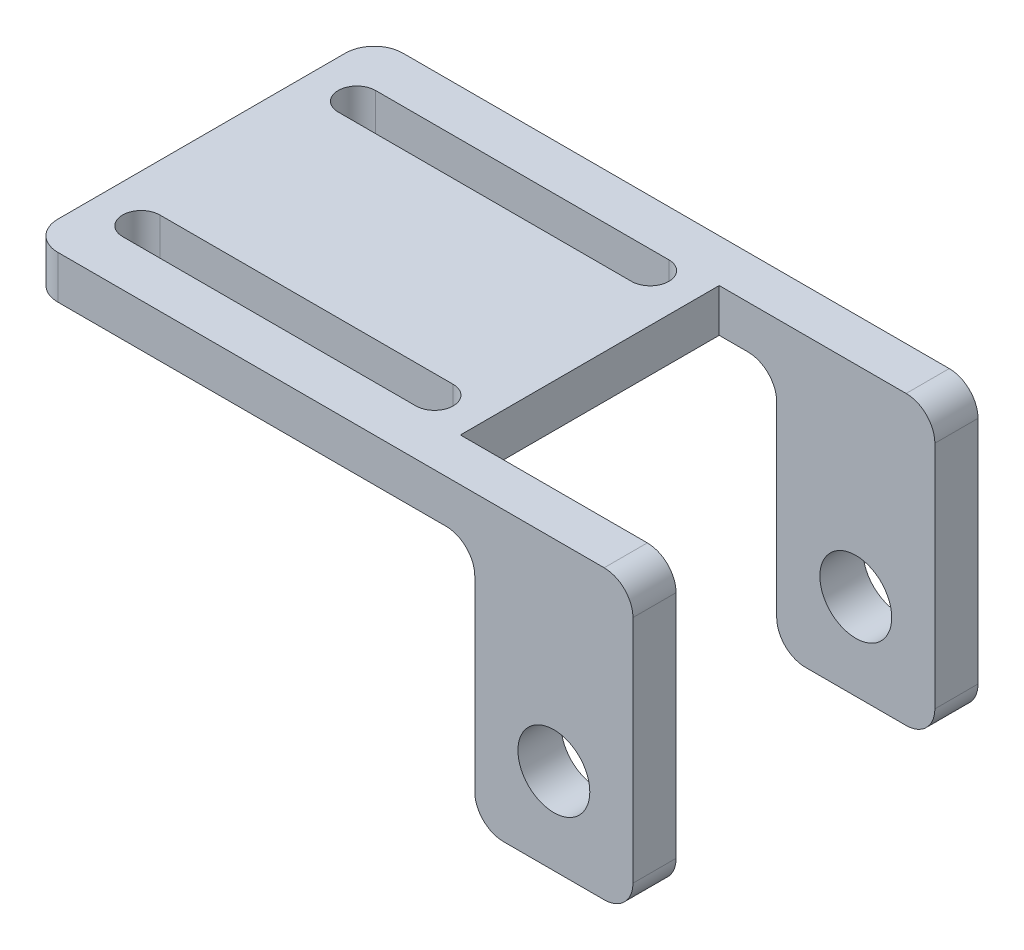
ISO-10303-21;
HEADER;
FILE_DESCRIPTION(('STEP AP214'),'2;1');
FILE_NAME('part.step','',(''),(''),'','','');
FILE_SCHEMA(('AUTOMOTIVE_DESIGN { 1 0 10303 214 1 1 1 1 }'));
ENDSEC;
DATA;
#1=APPLICATION_CONTEXT('core data for automotive mechanical design processes');
#2=APPLICATION_PROTOCOL_DEFINITION('international standard','automotive_design',2000,#1);
#3=PRODUCT_CONTEXT('',#1,'mechanical');
#4=PRODUCT('Part','Part','',(#3));
#5=PRODUCT_RELATED_PRODUCT_CATEGORY('part','',(#4));
#6=PRODUCT_DEFINITION_FORMATION('','',#4);
#7=PRODUCT_DEFINITION_CONTEXT('part definition',#1,'design');
#8=PRODUCT_DEFINITION('design','',#6,#7);
#9=PRODUCT_DEFINITION_SHAPE('','',#8);
#10=(LENGTH_UNIT() NAMED_UNIT(*) SI_UNIT(.MILLI.,.METRE.));
#11=(NAMED_UNIT(*) PLANE_ANGLE_UNIT() SI_UNIT($,.RADIAN.));
#12=(NAMED_UNIT(*) SI_UNIT($,.STERADIAN.) SOLID_ANGLE_UNIT());
#13=UNCERTAINTY_MEASURE_WITH_UNIT(LENGTH_MEASURE(1.E-05),#10,'distance_accuracy_value','');
#14=(GEOMETRIC_REPRESENTATION_CONTEXT(3) GLOBAL_UNCERTAINTY_ASSIGNED_CONTEXT((#13)) GLOBAL_UNIT_ASSIGNED_CONTEXT((#10,
#11,#12)) REPRESENTATION_CONTEXT('',''));
#15=CARTESIAN_POINT('',(0.,0.,0.));
#16=DIRECTION('',(0.,0.,1.));
#17=DIRECTION('',(1.,0.,0.));
#18=AXIS2_PLACEMENT_3D('',#15,#16,#17);
#19=CARTESIAN_POINT('',(42.,3.,0.));
#20=DIRECTION('',(-1.,0.,0.));
#21=DIRECTION('',(0.,0.,1.));
#22=AXIS2_PLACEMENT_3D('',#19,#20,#21);
#23=PLANE('',#22);
#24=DIRECTION('',(0.,1.,0.));
#25=VECTOR('',#24,1.);
#26=CARTESIAN_POINT('',(42.,-17.,-3.));
#27=LINE('',#26,#25);
#28=CARTESIAN_POINT('',(42.,-15.,-3.));
#29=VERTEX_POINT('',#28);
#30=CARTESIAN_POINT('',(42.,1.,-3.));
#31=VERTEX_POINT('',#30);
#32=EDGE_CURVE('E351',#29,#31,#27,.T.);
#33=ORIENTED_EDGE('',*,*,#32,.T.);
#34=DIRECTION('',(0.,0.,-1.));
#35=VECTOR('',#34,1.);
#36=CARTESIAN_POINT('',(42.,1.,0.));
#37=LINE('',#36,#35);
#38=CARTESIAN_POINT('',(42.,1.,0.));
#39=VERTEX_POINT('',#38);
#40=EDGE_CURVE('E434',#31,#39,#37,.F.);
#41=ORIENTED_EDGE('',*,*,#40,.T.);
#42=DIRECTION('',(0.,-1.,0.));
#43=VECTOR('',#42,1.);
#44=CARTESIAN_POINT('',(42.,3.,0.));
#45=LINE('',#44,#43);
#46=CARTESIAN_POINT('',(42.,-15.,0.));
#47=VERTEX_POINT('',#46);
#48=EDGE_CURVE('E379',#39,#47,#45,.T.);
#49=ORIENTED_EDGE('',*,*,#48,.T.);
#50=DIRECTION('',(0.,0.,1.));
#51=VECTOR('',#50,1.);
#52=CARTESIAN_POINT('',(42.,-15.,0.));
#53=LINE('',#52,#51);
#54=EDGE_CURVE('E432',#47,#29,#53,.F.);
#55=ORIENTED_EDGE('',*,*,#54,.T.);
#56=EDGE_LOOP('',(#33,#41,#49,#55));
#57=FACE_BOUND('',#56,.T.);
#58=ADVANCED_FACE('F39',(#57),#23,.F.);
#59=CARTESIAN_POINT('',(0.,0.,0.));
#60=DIRECTION('',(0.,-1.,0.));
#61=DIRECTION('',(0.,0.,-1.));
#62=AXIS2_PLACEMENT_3D('',#59,#60,#61);
#63=PLANE('',#62);
#64=CARTESIAN_POINT('',(3.29999999999999,0.,-19.5));
#65=DIRECTION('',(0.,-1.,0.));
#66=DIRECTION('',(0.,0.,-1.));
#67=AXIS2_PLACEMENT_3D('',#64,#65,#66);
#68=CIRCLE('',#67,1.3);
#69=CARTESIAN_POINT('',(3.29999999999999,0.,-18.2));
#70=VERTEX_POINT('',#69);
#71=CARTESIAN_POINT('',(3.29999999999999,0.,-20.8));
#72=VERTEX_POINT('',#71);
#73=EDGE_CURVE('E297',#70,#72,#68,.T.);
#74=ORIENTED_EDGE('',*,*,#73,.F.);
#75=DIRECTION('',(-1.,0.,0.));
#76=VECTOR('',#75,1.);
#77=CARTESIAN_POINT('',(0.,0.,-18.2));
#78=LINE('',#77,#76);
#79=CARTESIAN_POINT('',(23.7,0.,-18.2));
#80=VERTEX_POINT('',#79);
#81=EDGE_CURVE('E292',#80,#70,#78,.T.);
#82=ORIENTED_EDGE('',*,*,#81,.F.);
#83=CARTESIAN_POINT('',(23.7,0.,-19.5));
#84=DIRECTION('',(0.,-1.,0.));
#85=DIRECTION('',(0.,0.,-1.));
#86=AXIS2_PLACEMENT_3D('',#83,#84,#85);
#87=CIRCLE('',#86,1.29999999999999);
#88=CARTESIAN_POINT('',(23.7,0.,-20.8));
#89=VERTEX_POINT('',#88);
#90=EDGE_CURVE('E240',#89,#80,#87,.T.);
#91=ORIENTED_EDGE('',*,*,#90,.F.);
#92=DIRECTION('',(1.,0.,0.));
#93=VECTOR('',#92,1.);
#94=CARTESIAN_POINT('',(0.,0.,-20.8));
#95=LINE('',#94,#93);
#96=EDGE_CURVE('E295',#72,#89,#95,.T.);
#97=ORIENTED_EDGE('',*,*,#96,.F.);
#98=EDGE_LOOP('',(#74,#82,#91,#97));
#99=FACE_BOUND('',#98,.T.);
#100=CARTESIAN_POINT('',(3.3,0.,-4.5));
#101=DIRECTION('',(0.,-1.,0.));
#102=DIRECTION('',(0.,0.,-1.));
#103=AXIS2_PLACEMENT_3D('',#100,#101,#102);
#104=CIRCLE('',#103,1.3);
#105=CARTESIAN_POINT('',(3.3,0.,-3.2));
#106=VERTEX_POINT('',#105);
#107=CARTESIAN_POINT('',(3.3,0.,-5.8));
#108=VERTEX_POINT('',#107);
#109=EDGE_CURVE('E290',#106,#108,#104,.T.);
#110=ORIENTED_EDGE('',*,*,#109,.F.);
#111=DIRECTION('',(-1.,0.,0.));
#112=VECTOR('',#111,1.);
#113=CARTESIAN_POINT('',(0.,0.,-3.2));
#114=LINE('',#113,#112);
#115=CARTESIAN_POINT('',(23.7,0.,-3.2));
#116=VERTEX_POINT('',#115);
#117=EDGE_CURVE('E264',#116,#106,#114,.T.);
#118=ORIENTED_EDGE('',*,*,#117,.F.);
#119=CARTESIAN_POINT('',(23.7,0.,-4.5));
#120=DIRECTION('',(0.,-1.,0.));
#121=DIRECTION('',(0.,0.,-1.));
#122=AXIS2_PLACEMENT_3D('',#119,#120,#121);
#123=CIRCLE('',#122,1.3);
#124=CARTESIAN_POINT('',(23.7,0.,-5.8));
#125=VERTEX_POINT('',#124);
#126=EDGE_CURVE('E286',#125,#116,#123,.T.);
#127=ORIENTED_EDGE('',*,*,#126,.F.);
#128=DIRECTION('',(1.,0.,0.));
#129=VECTOR('',#128,1.);
#130=CARTESIAN_POINT('',(0.,0.,-5.8));
#131=LINE('',#130,#129);
#132=EDGE_CURVE('E288',#108,#125,#131,.T.);
#133=ORIENTED_EDGE('',*,*,#132,.F.);
#134=EDGE_LOOP('',(#110,#118,#127,#133));
#135=FACE_BOUND('',#134,.T.);
#136=DIRECTION('',(1.,0.,0.));
#137=VECTOR('',#136,1.);
#138=CARTESIAN_POINT('',(42.,0.,-3.));
#139=LINE('',#138,#137);
#140=CARTESIAN_POINT('',(27.,0.,-3.));
#141=VERTEX_POINT('',#140);
#142=CARTESIAN_POINT('',(29.,0.,-3.));
#143=VERTEX_POINT('',#142);
#144=EDGE_CURVE('E306',#141,#143,#139,.T.);
#145=ORIENTED_EDGE('',*,*,#144,.T.);
#146=DIRECTION('',(0.,0.,-1.));
#147=VECTOR('',#146,1.);
#148=CARTESIAN_POINT('',(29.,0.,0.));
#149=LINE('',#148,#147);
#150=CARTESIAN_POINT('',(29.,0.,0.));
#151=VERTEX_POINT('',#150);
#152=EDGE_CURVE('E463',#143,#151,#149,.F.);
#153=ORIENTED_EDGE('',*,*,#152,.T.);
#154=DIRECTION('',(1.,0.,0.));
#155=VECTOR('',#154,1.);
#156=CARTESIAN_POINT('',(0.,0.,0.));
#157=LINE('',#156,#155);
#158=CARTESIAN_POINT('',(2.,0.,0.));
#159=VERTEX_POINT('',#158);
#160=EDGE_CURVE('E373',#159,#151,#157,.T.);
#161=ORIENTED_EDGE('',*,*,#160,.F.);
#162=CARTESIAN_POINT('',(2.,0.,-2.));
#163=DIRECTION('',(0.,-1.,0.));
#164=DIRECTION('',(0.,0.,-1.));
#165=AXIS2_PLACEMENT_3D('',#162,#163,#164);
#166=CIRCLE('',#165,2.);
#167=CARTESIAN_POINT('',(0.,0.,-2.));
#168=VERTEX_POINT('',#167);
#169=EDGE_CURVE('E389',#159,#168,#166,.T.);
#170=ORIENTED_EDGE('',*,*,#169,.T.);
#171=DIRECTION('',(0.,0.,1.));
#172=VECTOR('',#171,1.);
#173=CARTESIAN_POINT('',(0.,0.,0.));
#174=LINE('',#173,#172);
#175=CARTESIAN_POINT('',(0.,0.,-22.));
#176=VERTEX_POINT('',#175);
#177=EDGE_CURVE('E360',#176,#168,#174,.T.);
#178=ORIENTED_EDGE('',*,*,#177,.F.);
#179=CARTESIAN_POINT('',(1.99999999999999,0.,-22.));
#180=DIRECTION('',(0.,-1.,0.));
#181=DIRECTION('',(0.,0.,-1.));
#182=AXIS2_PLACEMENT_3D('',#179,#180,#181);
#183=CIRCLE('',#182,2.);
#184=CARTESIAN_POINT('',(1.99999999999999,0.,-24.));
#185=VERTEX_POINT('',#184);
#186=EDGE_CURVE('E391',#176,#185,#183,.T.);
#187=ORIENTED_EDGE('',*,*,#186,.T.);
#188=DIRECTION('',(-1.,0.,0.));
#189=VECTOR('',#188,1.);
#190=CARTESIAN_POINT('',(0.,0.,-24.));
#191=LINE('',#190,#189);
#192=CARTESIAN_POINT('',(29.,0.,-24.));
#193=VERTEX_POINT('',#192);
#194=EDGE_CURVE('E365',#193,#185,#191,.T.);
#195=ORIENTED_EDGE('',*,*,#194,.F.);
#196=DIRECTION('',(0.,0.,-1.));
#197=VECTOR('',#196,1.);
#198=CARTESIAN_POINT('',(29.,0.,0.));
#199=LINE('',#198,#197);
#200=CARTESIAN_POINT('',(29.,0.,-21.));
#201=VERTEX_POINT('',#200);
#202=EDGE_CURVE('E461',#193,#201,#199,.F.);
#203=ORIENTED_EDGE('',*,*,#202,.T.);
#204=DIRECTION('',(-1.,0.,0.));
#205=VECTOR('',#204,1.);
#206=CARTESIAN_POINT('',(42.,0.,-21.));
#207=LINE('',#206,#205);
#208=CARTESIAN_POINT('',(27.,0.,-21.));
#209=VERTEX_POINT('',#208);
#210=EDGE_CURVE('E300',#201,#209,#207,.T.);
#211=ORIENTED_EDGE('',*,*,#210,.T.);
#212=DIRECTION('',(0.,0.,1.));
#213=VECTOR('',#212,1.);
#214=CARTESIAN_POINT('',(27.,0.,-21.));
#215=LINE('',#214,#213);
#216=EDGE_CURVE('E302',#209,#141,#215,.T.);
#217=ORIENTED_EDGE('',*,*,#216,.T.);
#218=EDGE_LOOP('',(#145,#153,#161,#170,#178,#187,#195,#203,#211,#217));
#219=FACE_BOUND('',#218,.T.);
#220=ADVANCED_FACE('F480',(#99,#135,#219),#63,.T.);
#221=CARTESIAN_POINT('',(0.,3.,0.));
#222=DIRECTION('',(1.,0.,0.));
#223=DIRECTION('',(0.,0.,-1.));
#224=AXIS2_PLACEMENT_3D('',#221,#222,#223);
#225=PLANE('',#224);
#226=DIRECTION('',(0.,0.,1.));
#227=VECTOR('',#226,1.);
#228=CARTESIAN_POINT('',(0.,3.,0.));
#229=LINE('',#228,#227);
#230=CARTESIAN_POINT('',(0.,3.,-22.));
#231=VERTEX_POINT('',#230);
#232=CARTESIAN_POINT('',(0.,3.,-2.));
#233=VERTEX_POINT('',#232);
#234=EDGE_CURVE('E361',#231,#233,#229,.T.);
#235=ORIENTED_EDGE('',*,*,#234,.F.);
#236=DIRECTION('',(0.,-1.,0.));
#237=VECTOR('',#236,1.);
#238=CARTESIAN_POINT('',(0.,3.,-22.));
#239=LINE('',#238,#237);
#240=EDGE_CURVE('E386',#231,#176,#239,.T.);
#241=ORIENTED_EDGE('',*,*,#240,.T.);
#242=ORIENTED_EDGE('',*,*,#177,.T.);
#243=DIRECTION('',(0.,-1.,0.));
#244=VECTOR('',#243,1.);
#245=CARTESIAN_POINT('',(0.,3.,-2.));
#246=LINE('',#245,#244);
#247=EDGE_CURVE('E382',#168,#233,#246,.F.);
#248=ORIENTED_EDGE('',*,*,#247,.T.);
#249=EDGE_LOOP('',(#235,#241,#242,#248));
#250=FACE_BOUND('',#249,.T.);
#251=ADVANCED_FACE('F565',(#250),#225,.F.);
#252=CARTESIAN_POINT('',(0.,3.,0.));
#253=DIRECTION('',(0.,0.,-1.));
#254=DIRECTION('',(-1.,0.,0.));
#255=AXIS2_PLACEMENT_3D('',#252,#253,#254);
#256=PLANE('',#255);
#257=CARTESIAN_POINT('',(36.5,-11.,0.));
#258=DIRECTION('',(0.,0.,1.));
#259=DIRECTION('',(1.,0.,0.));
#260=AXIS2_PLACEMENT_3D('',#257,#258,#259);
#261=CIRCLE('',#260,2.5);
#262=CARTESIAN_POINT('',(39.,-11.,0.));
#263=VERTEX_POINT('',#262);
#264=EDGE_CURVE('E318',#263,#263,#261,.T.);
#265=ORIENTED_EDGE('',*,*,#264,.F.);
#266=EDGE_LOOP('',(#265));
#267=FACE_BOUND('',#266,.T.);
#268=ORIENTED_EDGE('',*,*,#48,.F.);
#269=CARTESIAN_POINT('',(40.,1.,0.));
#270=DIRECTION('',(0.,0.,-1.));
#271=DIRECTION('',(-1.,0.,0.));
#272=AXIS2_PLACEMENT_3D('',#269,#270,#271);
#273=CIRCLE('',#272,2.);
#274=CARTESIAN_POINT('',(40.,3.,0.));
#275=VERTEX_POINT('',#274);
#276=EDGE_CURVE('E440',#39,#275,#273,.F.);
#277=ORIENTED_EDGE('',*,*,#276,.T.);
#278=DIRECTION('',(1.,0.,0.));
#279=VECTOR('',#278,1.);
#280=CARTESIAN_POINT('',(0.,3.,0.));
#281=LINE('',#280,#279);
#282=CARTESIAN_POINT('',(2.,3.,0.));
#283=VERTEX_POINT('',#282);
#284=EDGE_CURVE('E364',#283,#275,#281,.T.);
#285=ORIENTED_EDGE('',*,*,#284,.F.);
#286=DIRECTION('',(0.,-1.,0.));
#287=VECTOR('',#286,1.);
#288=CARTESIAN_POINT('',(2.,3.,0.));
#289=LINE('',#288,#287);
#290=EDGE_CURVE('E401',#283,#159,#289,.T.);
#291=ORIENTED_EDGE('',*,*,#290,.T.);
#292=ORIENTED_EDGE('',*,*,#160,.T.);
#293=CARTESIAN_POINT('',(29.,-2.,0.));
#294=DIRECTION('',(0.,0.,-1.));
#295=DIRECTION('',(-1.,0.,0.));
#296=AXIS2_PLACEMENT_3D('',#293,#294,#295);
#297=CIRCLE('',#296,2.);
#298=CARTESIAN_POINT('',(31.,-2.,0.));
#299=VERTEX_POINT('',#298);
#300=EDGE_CURVE('E470',#151,#299,#297,.T.);
#301=ORIENTED_EDGE('',*,*,#300,.T.);
#302=DIRECTION('',(0.,1.,0.));
#303=VECTOR('',#302,1.);
#304=CARTESIAN_POINT('',(31.,-17.,0.));
#305=LINE('',#304,#303);
#306=CARTESIAN_POINT('',(31.,-15.,0.));
#307=VERTEX_POINT('',#306);
#308=EDGE_CURVE('E357',#307,#299,#305,.T.);
#309=ORIENTED_EDGE('',*,*,#308,.F.);
#310=CARTESIAN_POINT('',(33.,-15.,0.));
#311=DIRECTION('',(0.,0.,-1.));
#312=DIRECTION('',(-1.,0.,0.));
#313=AXIS2_PLACEMENT_3D('',#310,#311,#312);
#314=CIRCLE('',#313,2.);
#315=CARTESIAN_POINT('',(33.,-17.,0.));
#316=VERTEX_POINT('',#315);
#317=EDGE_CURVE('E436',#307,#316,#314,.F.);
#318=ORIENTED_EDGE('',*,*,#317,.T.);
#319=DIRECTION('',(-1.,0.,0.));
#320=VECTOR('',#319,1.);
#321=CARTESIAN_POINT('',(42.,-17.,0.));
#322=LINE('',#321,#320);
#323=CARTESIAN_POINT('',(40.,-17.,0.));
#324=VERTEX_POINT('',#323);
#325=EDGE_CURVE('E345',#324,#316,#322,.T.);
#326=ORIENTED_EDGE('',*,*,#325,.F.);
#327=CARTESIAN_POINT('',(40.,-15.,0.));
#328=DIRECTION('',(0.,0.,-1.));
#329=DIRECTION('',(-1.,0.,0.));
#330=AXIS2_PLACEMENT_3D('',#327,#328,#329);
#331=CIRCLE('',#330,2.);
#332=EDGE_CURVE('E438',#324,#47,#331,.F.);
#333=ORIENTED_EDGE('',*,*,#332,.T.);
#334=EDGE_LOOP('',(#268,#277,#285,#291,#292,#301,#309,#318,#326,#333));
#335=FACE_BOUND('',#334,.T.);
#336=ADVANCED_FACE('F532',(#267,#335),#256,.F.);
#337=DIRECTION('',(0.,-1.,0.));
#338=VECTOR('',#337,1.);
#339=CARTESIAN_POINT('',(42.,3.,-24.));
#340=LINE('',#339,#338);
#341=CARTESIAN_POINT('',(42.,1.,-24.));
#342=VERTEX_POINT('',#341);
#343=CARTESIAN_POINT('',(42.,-15.,-24.));
#344=VERTEX_POINT('',#343);
#345=EDGE_CURVE('E370',#342,#344,#340,.T.);
#346=ORIENTED_EDGE('',*,*,#345,.F.);
#347=DIRECTION('',(0.,0.,-1.));
#348=VECTOR('',#347,1.);
#349=CARTESIAN_POINT('',(42.,1.,0.));
#350=LINE('',#349,#348);
#351=CARTESIAN_POINT('',(42.,1.,-21.));
#352=VERTEX_POINT('',#351);
#353=EDGE_CURVE('E418',#342,#352,#350,.F.);
#354=ORIENTED_EDGE('',*,*,#353,.T.);
#355=DIRECTION('',(0.,1.,0.));
#356=VECTOR('',#355,1.);
#357=CARTESIAN_POINT('',(42.,-17.,-21.));
#358=LINE('',#357,#356);
#359=CARTESIAN_POINT('',(42.,-15.,-21.));
#360=VERTEX_POINT('',#359);
#361=EDGE_CURVE('E342',#360,#352,#358,.T.);
#362=ORIENTED_EDGE('',*,*,#361,.F.);
#363=DIRECTION('',(0.,0.,1.));
#364=VECTOR('',#363,1.);
#365=CARTESIAN_POINT('',(42.,-15.,-24.));
#366=LINE('',#365,#364);
#367=EDGE_CURVE('E416',#360,#344,#366,.F.);
#368=ORIENTED_EDGE('',*,*,#367,.T.);
#369=EDGE_LOOP('',(#346,#354,#362,#368));
#370=FACE_BOUND('',#369,.T.);
#371=ADVANCED_FACE('F509',(#370),#23,.F.);
#372=CARTESIAN_POINT('',(0.,3.,-24.));
#373=DIRECTION('',(0.,0.,1.));
#374=DIRECTION('',(1.,0.,0.));
#375=AXIS2_PLACEMENT_3D('',#372,#373,#374);
#376=PLANE('',#375);
#377=CARTESIAN_POINT('',(36.5,-11.,-24.));
#378=DIRECTION('',(0.,0.,1.));
#379=DIRECTION('',(1.,0.,0.));
#380=AXIS2_PLACEMENT_3D('',#377,#378,#379);
#381=CIRCLE('',#380,2.5);
#382=CARTESIAN_POINT('',(39.,-11.,-24.));
#383=VERTEX_POINT('',#382);
#384=EDGE_CURVE('E321',#383,#383,#381,.T.);
#385=ORIENTED_EDGE('',*,*,#384,.T.);
#386=EDGE_LOOP('',(#385));
#387=FACE_BOUND('',#386,.T.);
#388=DIRECTION('',(-1.,0.,0.));
#389=VECTOR('',#388,1.);
#390=CARTESIAN_POINT('',(0.,3.,-24.));
#391=LINE('',#390,#389);
#392=CARTESIAN_POINT('',(40.,3.,-24.));
#393=VERTEX_POINT('',#392);
#394=CARTESIAN_POINT('',(1.99999999999999,3.,-24.));
#395=VERTEX_POINT('',#394);
#396=EDGE_CURVE('E368',#393,#395,#391,.T.);
#397=ORIENTED_EDGE('',*,*,#396,.F.);
#398=CARTESIAN_POINT('',(40.,1.,-24.));
#399=DIRECTION('',(0.,0.,1.));
#400=DIRECTION('',(1.,0.,0.));
#401=AXIS2_PLACEMENT_3D('',#398,#399,#400);
#402=CIRCLE('',#401,2.);
#403=EDGE_CURVE('E414',#393,#342,#402,.F.);
#404=ORIENTED_EDGE('',*,*,#403,.T.);
#405=ORIENTED_EDGE('',*,*,#345,.T.);
#406=CARTESIAN_POINT('',(40.,-15.,-24.));
#407=DIRECTION('',(0.,0.,1.));
#408=DIRECTION('',(1.,0.,0.));
#409=AXIS2_PLACEMENT_3D('',#406,#407,#408);
#410=CIRCLE('',#409,2.);
#411=CARTESIAN_POINT('',(40.,-17.,-24.));
#412=VERTEX_POINT('',#411);
#413=EDGE_CURVE('E412',#344,#412,#410,.F.);
#414=ORIENTED_EDGE('',*,*,#413,.T.);
#415=DIRECTION('',(1.,0.,0.));
#416=VECTOR('',#415,1.);
#417=CARTESIAN_POINT('',(42.,-17.,-24.));
#418=LINE('',#417,#416);
#419=CARTESIAN_POINT('',(33.,-17.,-24.));
#420=VERTEX_POINT('',#419);
#421=EDGE_CURVE('E333',#420,#412,#418,.T.);
#422=ORIENTED_EDGE('',*,*,#421,.F.);
#423=CARTESIAN_POINT('',(33.,-15.,-24.));
#424=DIRECTION('',(0.,0.,1.));
#425=DIRECTION('',(1.,0.,0.));
#426=AXIS2_PLACEMENT_3D('',#423,#424,#425);
#427=CIRCLE('',#426,2.);
#428=CARTESIAN_POINT('',(31.,-15.,-24.));
#429=VERTEX_POINT('',#428);
#430=EDGE_CURVE('E410',#420,#429,#427,.F.);
#431=ORIENTED_EDGE('',*,*,#430,.T.);
#432=DIRECTION('',(0.,1.,0.));
#433=VECTOR('',#432,1.);
#434=CARTESIAN_POINT('',(31.,-17.,-24.));
#435=LINE('',#434,#433);
#436=CARTESIAN_POINT('',(31.,-2.,-24.));
#437=VERTEX_POINT('',#436);
#438=EDGE_CURVE('E336',#429,#437,#435,.T.);
#439=ORIENTED_EDGE('',*,*,#438,.T.);
#440=CARTESIAN_POINT('',(29.,-2.,-24.));
#441=DIRECTION('',(0.,0.,1.));
#442=DIRECTION('',(1.,0.,0.));
#443=AXIS2_PLACEMENT_3D('',#440,#441,#442);
#444=CIRCLE('',#443,2.);
#445=EDGE_CURVE('E47',#437,#193,#444,.T.);
#446=ORIENTED_EDGE('',*,*,#445,.T.);
#447=ORIENTED_EDGE('',*,*,#194,.T.);
#448=DIRECTION('',(0.,-1.,0.));
#449=VECTOR('',#448,1.);
#450=CARTESIAN_POINT('',(1.99999999999999,3.,-24.));
#451=LINE('',#450,#449);
#452=EDGE_CURVE('E394',#185,#395,#451,.F.);
#453=ORIENTED_EDGE('',*,*,#452,.T.);
#454=EDGE_LOOP('',(#397,#404,#405,#414,#422,#431,#439,#446,#447,#453));
#455=FACE_BOUND('',#454,.T.);
#456=ADVANCED_FACE('F474',(#387,#455),#376,.F.);
#457=CARTESIAN_POINT('',(0.,3.,0.));
#458=DIRECTION('',(0.,-1.,0.));
#459=DIRECTION('',(0.,0.,-1.));
#460=AXIS2_PLACEMENT_3D('',#457,#458,#459);
#461=PLANE('',#460);
#462=DIRECTION('',(1.,0.,0.));
#463=VECTOR('',#462,1.);
#464=CARTESIAN_POINT('',(3.29999999999999,3.,-18.2));
#465=LINE('',#464,#463);
#466=CARTESIAN_POINT('',(3.29999999999999,3.,-18.2));
#467=VERTEX_POINT('',#466);
#468=CARTESIAN_POINT('',(23.7,3.,-18.2));
#469=VERTEX_POINT('',#468);
#470=EDGE_CURVE('E247',#467,#469,#465,.T.);
#471=ORIENTED_EDGE('',*,*,#470,.F.);
#472=CARTESIAN_POINT('',(3.29999999999999,3.,-19.5));
#473=DIRECTION('',(0.,1.,0.));
#474=DIRECTION('',(0.,0.,1.));
#475=AXIS2_PLACEMENT_3D('',#472,#473,#474);
#476=CIRCLE('',#475,1.3);
#477=CARTESIAN_POINT('',(3.29999999999999,3.,-20.8));
#478=VERTEX_POINT('',#477);
#479=EDGE_CURVE('E252',#478,#467,#476,.T.);
#480=ORIENTED_EDGE('',*,*,#479,.F.);
#481=DIRECTION('',(-1.,0.,0.));
#482=VECTOR('',#481,1.);
#483=CARTESIAN_POINT('',(3.29999999999999,3.,-20.8));
#484=LINE('',#483,#482);
#485=CARTESIAN_POINT('',(23.7,3.,-20.8));
#486=VERTEX_POINT('',#485);
#487=EDGE_CURVE('E257',#486,#478,#484,.T.);
#488=ORIENTED_EDGE('',*,*,#487,.F.);
#489=CARTESIAN_POINT('',(23.7,3.,-19.5));
#490=DIRECTION('',(0.,1.,0.));
#491=DIRECTION('',(0.,0.,1.));
#492=AXIS2_PLACEMENT_3D('',#489,#490,#491);
#493=CIRCLE('',#492,1.29999999999999);
#494=EDGE_CURVE('E237',#469,#486,#493,.T.);
#495=ORIENTED_EDGE('',*,*,#494,.F.);
#496=EDGE_LOOP('',(#471,#480,#488,#495));
#497=FACE_BOUND('',#496,.T.);
#498=DIRECTION('',(1.,0.,0.));
#499=VECTOR('',#498,1.);
#500=CARTESIAN_POINT('',(3.3,3.,-3.2));
#501=LINE('',#500,#499);
#502=CARTESIAN_POINT('',(3.3,3.,-3.2));
#503=VERTEX_POINT('',#502);
#504=CARTESIAN_POINT('',(23.7,3.,-3.2));
#505=VERTEX_POINT('',#504);
#506=EDGE_CURVE('E269',#503,#505,#501,.T.);
#507=ORIENTED_EDGE('',*,*,#506,.F.);
#508=CARTESIAN_POINT('',(3.3,3.,-4.5));
#509=DIRECTION('',(0.,1.,0.));
#510=DIRECTION('',(0.,0.,1.));
#511=AXIS2_PLACEMENT_3D('',#508,#509,#510);
#512=CIRCLE('',#511,1.3);
#513=CARTESIAN_POINT('',(3.3,3.,-5.8));
#514=VERTEX_POINT('',#513);
#515=EDGE_CURVE('E267',#514,#503,#512,.T.);
#516=ORIENTED_EDGE('',*,*,#515,.F.);
#517=DIRECTION('',(-1.,0.,0.));
#518=VECTOR('',#517,1.);
#519=CARTESIAN_POINT('',(3.3,3.,-5.8));
#520=LINE('',#519,#518);
#521=CARTESIAN_POINT('',(23.7,3.,-5.8));
#522=VERTEX_POINT('',#521);
#523=EDGE_CURVE('E274',#522,#514,#520,.T.);
#524=ORIENTED_EDGE('',*,*,#523,.F.);
#525=CARTESIAN_POINT('',(23.7,3.,-4.5));
#526=DIRECTION('',(0.,1.,0.));
#527=DIRECTION('',(0.,0.,1.));
#528=AXIS2_PLACEMENT_3D('',#525,#526,#527);
#529=CIRCLE('',#528,1.3);
#530=EDGE_CURVE('E271',#505,#522,#529,.T.);
#531=ORIENTED_EDGE('',*,*,#530,.F.);
#532=EDGE_LOOP('',(#507,#516,#524,#531));
#533=FACE_BOUND('',#532,.T.);
#534=DIRECTION('',(-1.,0.,0.));
#535=VECTOR('',#534,1.);
#536=CARTESIAN_POINT('',(42.,3.,-21.));
#537=LINE('',#536,#535);
#538=CARTESIAN_POINT('',(40.,3.,-21.));
#539=VERTEX_POINT('',#538);
#540=CARTESIAN_POINT('',(27.,3.,-21.));
#541=VERTEX_POINT('',#540);
#542=EDGE_CURVE('E299',#539,#541,#537,.T.);
#543=ORIENTED_EDGE('',*,*,#542,.F.);
#544=DIRECTION('',(0.,0.,-1.));
#545=VECTOR('',#544,1.);
#546=CARTESIAN_POINT('',(40.,3.,0.));
#547=LINE('',#546,#545);
#548=EDGE_CURVE('E407',#539,#393,#547,.T.);
#549=ORIENTED_EDGE('',*,*,#548,.T.);
#550=ORIENTED_EDGE('',*,*,#396,.T.);
#551=CARTESIAN_POINT('',(1.99999999999999,3.,-22.));
#552=DIRECTION('',(0.,-1.,0.));
#553=DIRECTION('',(0.,0.,-1.));
#554=AXIS2_PLACEMENT_3D('',#551,#552,#553);
#555=CIRCLE('',#554,2.);
#556=EDGE_CURVE('E399',#395,#231,#555,.F.);
#557=ORIENTED_EDGE('',*,*,#556,.T.);
#558=ORIENTED_EDGE('',*,*,#234,.T.);
#559=CARTESIAN_POINT('',(2.,3.,-2.));
#560=DIRECTION('',(0.,-1.,0.));
#561=DIRECTION('',(0.,0.,-1.));
#562=AXIS2_PLACEMENT_3D('',#559,#560,#561);
#563=CIRCLE('',#562,2.);
#564=EDGE_CURVE('E397',#233,#283,#563,.F.);
#565=ORIENTED_EDGE('',*,*,#564,.T.);
#566=ORIENTED_EDGE('',*,*,#284,.T.);
#567=DIRECTION('',(0.,0.,-1.));
#568=VECTOR('',#567,1.);
#569=CARTESIAN_POINT('',(40.,3.,0.));
#570=LINE('',#569,#568);
#571=CARTESIAN_POINT('',(40.,3.,-3.));
#572=VERTEX_POINT('',#571);
#573=EDGE_CURVE('E404',#275,#572,#570,.T.);
#574=ORIENTED_EDGE('',*,*,#573,.T.);
#575=DIRECTION('',(1.,0.,0.));
#576=VECTOR('',#575,1.);
#577=CARTESIAN_POINT('',(42.,3.,-3.));
#578=LINE('',#577,#576);
#579=CARTESIAN_POINT('',(27.,3.,-3.));
#580=VERTEX_POINT('',#579);
#581=EDGE_CURVE('E303',#580,#572,#578,.T.);
#582=ORIENTED_EDGE('',*,*,#581,.F.);
#583=DIRECTION('',(0.,0.,1.));
#584=VECTOR('',#583,1.);
#585=CARTESIAN_POINT('',(27.,3.,-21.));
#586=LINE('',#585,#584);
#587=EDGE_CURVE('E311',#541,#580,#586,.T.);
#588=ORIENTED_EDGE('',*,*,#587,.F.);
#589=EDGE_LOOP('',(#543,#549,#550,#557,#558,#565,#566,#574,#582,#588));
#590=FACE_BOUND('',#589,.T.);
#591=ADVANCED_FACE('F254',(#497,#533,#590),#461,.F.);
#592=CARTESIAN_POINT('',(31.,-17.,0.));
#593=DIRECTION('',(1.,0.,0.));
#594=DIRECTION('',(0.,0.,-1.));
#595=AXIS2_PLACEMENT_3D('',#592,#593,#594);
#596=PLANE('',#595);
#597=ORIENTED_EDGE('',*,*,#308,.T.);
#598=DIRECTION('',(0.,0.,-1.));
#599=VECTOR('',#598,1.);
#600=CARTESIAN_POINT('',(31.,-2.,0.));
#601=LINE('',#600,#599);
#602=CARTESIAN_POINT('',(31.,-2.,-3.));
#603=VERTEX_POINT('',#602);
#604=EDGE_CURVE('E458',#299,#603,#601,.T.);
#605=ORIENTED_EDGE('',*,*,#604,.T.);
#606=DIRECTION('',(0.,1.,0.));
#607=VECTOR('',#606,1.);
#608=CARTESIAN_POINT('',(31.,-17.,-3.));
#609=LINE('',#608,#607);
#610=CARTESIAN_POINT('',(31.,-15.,-3.));
#611=VERTEX_POINT('',#610);
#612=EDGE_CURVE('E354',#611,#603,#609,.T.);
#613=ORIENTED_EDGE('',*,*,#612,.F.);
#614=DIRECTION('',(0.,0.,-1.));
#615=VECTOR('',#614,1.);
#616=CARTESIAN_POINT('',(31.,-15.,0.));
#617=LINE('',#616,#615);
#618=EDGE_CURVE('E456',#611,#307,#617,.F.);
#619=ORIENTED_EDGE('',*,*,#618,.T.);
#620=EDGE_LOOP('',(#597,#605,#613,#619));
#621=FACE_BOUND('',#620,.T.);
#622=ADVANCED_FACE('F535',(#621),#596,.F.);
#623=CARTESIAN_POINT('',(42.,-17.,-3.));
#624=DIRECTION('',(0.,0.,1.));
#625=DIRECTION('',(1.,0.,0.));
#626=AXIS2_PLACEMENT_3D('',#623,#624,#625);
#627=PLANE('',#626);
#628=CARTESIAN_POINT('',(36.5,-11.,-3.));
#629=DIRECTION('',(0.,0.,1.));
#630=DIRECTION('',(1.,0.,0.));
#631=AXIS2_PLACEMENT_3D('',#628,#629,#630);
#632=CIRCLE('',#631,2.5);
#633=CARTESIAN_POINT('',(39.,-11.,-3.));
#634=VERTEX_POINT('',#633);
#635=EDGE_CURVE('E327',#634,#634,#632,.T.);
#636=ORIENTED_EDGE('',*,*,#635,.T.);
#637=EDGE_LOOP('',(#636));
#638=FACE_BOUND('',#637,.T.);
#639=ORIENTED_EDGE('',*,*,#581,.T.);
#640=CARTESIAN_POINT('',(40.,1.,-3.));
#641=DIRECTION('',(0.,0.,1.));
#642=DIRECTION('',(1.,0.,0.));
#643=AXIS2_PLACEMENT_3D('',#640,#641,#642);
#644=CIRCLE('',#643,2.);
#645=EDGE_CURVE('E430',#572,#31,#644,.F.);
#646=ORIENTED_EDGE('',*,*,#645,.T.);
#647=ORIENTED_EDGE('',*,*,#32,.F.);
#648=CARTESIAN_POINT('',(40.,-15.,-3.));
#649=DIRECTION('',(0.,0.,1.));
#650=DIRECTION('',(1.,0.,0.));
#651=AXIS2_PLACEMENT_3D('',#648,#649,#650);
#652=CIRCLE('',#651,2.);
#653=CARTESIAN_POINT('',(40.,-17.,-3.));
#654=VERTEX_POINT('',#653);
#655=EDGE_CURVE('E428',#29,#654,#652,.F.);
#656=ORIENTED_EDGE('',*,*,#655,.T.);
#657=DIRECTION('',(1.,0.,0.));
#658=VECTOR('',#657,1.);
#659=CARTESIAN_POINT('',(42.,-17.,-3.));
#660=LINE('',#659,#658);
#661=CARTESIAN_POINT('',(33.,-17.,-3.));
#662=VERTEX_POINT('',#661);
#663=EDGE_CURVE('E348',#662,#654,#660,.T.);
#664=ORIENTED_EDGE('',*,*,#663,.F.);
#665=CARTESIAN_POINT('',(33.,-15.,-3.));
#666=DIRECTION('',(0.,0.,1.));
#667=DIRECTION('',(1.,0.,0.));
#668=AXIS2_PLACEMENT_3D('',#665,#666,#667);
#669=CIRCLE('',#668,2.);
#670=EDGE_CURVE('E426',#662,#611,#669,.F.);
#671=ORIENTED_EDGE('',*,*,#670,.T.);
#672=ORIENTED_EDGE('',*,*,#612,.T.);
#673=CARTESIAN_POINT('',(29.,-2.,-3.));
#674=DIRECTION('',(0.,0.,1.));
#675=DIRECTION('',(1.,0.,0.));
#676=AXIS2_PLACEMENT_3D('',#673,#674,#675);
#677=CIRCLE('',#676,2.);
#678=EDGE_CURVE('E468',#603,#143,#677,.T.);
#679=ORIENTED_EDGE('',*,*,#678,.T.);
#680=ORIENTED_EDGE('',*,*,#144,.F.);
#681=DIRECTION('',(0.,1.,0.));
#682=VECTOR('',#681,1.);
#683=CARTESIAN_POINT('',(27.,0.,-3.));
#684=LINE('',#683,#682);
#685=EDGE_CURVE('E316',#141,#580,#684,.T.);
#686=ORIENTED_EDGE('',*,*,#685,.T.);
#687=EDGE_LOOP('',(#639,#646,#647,#656,#664,#671,#672,#679,#680,#686));
#688=FACE_BOUND('',#687,.T.);
#689=ADVANCED_FACE('F607',(#638,#688),#627,.F.);
#690=CARTESIAN_POINT('',(0.,-17.,0.));
#691=DIRECTION('',(0.,1.,0.));
#692=DIRECTION('',(0.,0.,1.));
#693=AXIS2_PLACEMENT_3D('',#690,#691,#692);
#694=PLANE('',#693);
#695=ORIENTED_EDGE('',*,*,#663,.T.);
#696=DIRECTION('',(0.,0.,1.));
#697=VECTOR('',#696,1.);
#698=CARTESIAN_POINT('',(40.,-17.,0.));
#699=LINE('',#698,#697);
#700=EDGE_CURVE('E451',#654,#324,#699,.T.);
#701=ORIENTED_EDGE('',*,*,#700,.T.);
#702=ORIENTED_EDGE('',*,*,#325,.T.);
#703=DIRECTION('',(0.,0.,-1.));
#704=VECTOR('',#703,1.);
#705=CARTESIAN_POINT('',(33.,-17.,0.));
#706=LINE('',#705,#704);
#707=EDGE_CURVE('E448',#316,#662,#706,.T.);
#708=ORIENTED_EDGE('',*,*,#707,.T.);
#709=EDGE_LOOP('',(#695,#701,#702,#708));
#710=FACE_BOUND('',#709,.T.);
#711=ADVANCED_FACE('F543',(#710),#694,.F.);
#712=CARTESIAN_POINT('',(42.,-17.,-21.));
#713=DIRECTION('',(0.,0.,-1.));
#714=DIRECTION('',(-1.,0.,0.));
#715=AXIS2_PLACEMENT_3D('',#712,#713,#714);
#716=PLANE('',#715);
#717=CARTESIAN_POINT('',(36.5,-11.,-21.));
#718=DIRECTION('',(0.,0.,-1.));
#719=DIRECTION('',(-1.,0.,0.));
#720=AXIS2_PLACEMENT_3D('',#717,#718,#719);
#721=CIRCLE('',#720,2.5);
#722=CARTESIAN_POINT('',(34.,-11.,-21.));
#723=VERTEX_POINT('',#722);
#724=EDGE_CURVE('E324',#723,#723,#721,.T.);
#725=ORIENTED_EDGE('',*,*,#724,.T.);
#726=EDGE_LOOP('',(#725));
#727=FACE_BOUND('',#726,.T.);
#728=ORIENTED_EDGE('',*,*,#361,.T.);
#729=CARTESIAN_POINT('',(40.,1.,-21.));
#730=DIRECTION('',(0.,0.,-1.));
#731=DIRECTION('',(-1.,0.,0.));
#732=AXIS2_PLACEMENT_3D('',#729,#730,#731);
#733=CIRCLE('',#732,2.);
#734=EDGE_CURVE('E424',#352,#539,#733,.F.);
#735=ORIENTED_EDGE('',*,*,#734,.T.);
#736=ORIENTED_EDGE('',*,*,#542,.T.);
#737=DIRECTION('',(0.,1.,0.));
#738=VECTOR('',#737,1.);
#739=CARTESIAN_POINT('',(27.,0.,-21.));
#740=LINE('',#739,#738);
#741=EDGE_CURVE('E309',#209,#541,#740,.T.);
#742=ORIENTED_EDGE('',*,*,#741,.F.);
#743=ORIENTED_EDGE('',*,*,#210,.F.);
#744=CARTESIAN_POINT('',(29.,-2.,-21.));
#745=DIRECTION('',(0.,0.,-1.));
#746=DIRECTION('',(-1.,0.,0.));
#747=AXIS2_PLACEMENT_3D('',#744,#745,#746);
#748=CIRCLE('',#747,2.);
#749=CARTESIAN_POINT('',(31.,-2.,-21.));
#750=VERTEX_POINT('',#749);
#751=EDGE_CURVE('E11',#201,#750,#748,.T.);
#752=ORIENTED_EDGE('',*,*,#751,.T.);
#753=DIRECTION('',(0.,1.,0.));
#754=VECTOR('',#753,1.);
#755=CARTESIAN_POINT('',(31.,-17.,-21.));
#756=LINE('',#755,#754);
#757=CARTESIAN_POINT('',(31.,-15.,-21.));
#758=VERTEX_POINT('',#757);
#759=EDGE_CURVE('E339',#758,#750,#756,.T.);
#760=ORIENTED_EDGE('',*,*,#759,.F.);
#761=CARTESIAN_POINT('',(33.,-15.,-21.));
#762=DIRECTION('',(0.,0.,-1.));
#763=DIRECTION('',(-1.,0.,0.));
#764=AXIS2_PLACEMENT_3D('',#761,#762,#763);
#765=CIRCLE('',#764,2.);
#766=CARTESIAN_POINT('',(33.,-17.,-21.));
#767=VERTEX_POINT('',#766);
#768=EDGE_CURVE('E420',#758,#767,#765,.F.);
#769=ORIENTED_EDGE('',*,*,#768,.T.);
#770=DIRECTION('',(-1.,0.,0.));
#771=VECTOR('',#770,1.);
#772=CARTESIAN_POINT('',(42.,-17.,-21.));
#773=LINE('',#772,#771);
#774=CARTESIAN_POINT('',(40.,-17.,-21.));
#775=VERTEX_POINT('',#774);
#776=EDGE_CURVE('E330',#775,#767,#773,.T.);
#777=ORIENTED_EDGE('',*,*,#776,.F.);
#778=CARTESIAN_POINT('',(40.,-15.,-21.));
#779=DIRECTION('',(0.,0.,-1.));
#780=DIRECTION('',(-1.,0.,0.));
#781=AXIS2_PLACEMENT_3D('',#778,#779,#780);
#782=CIRCLE('',#781,2.);
#783=EDGE_CURVE('E422',#775,#360,#782,.F.);
#784=ORIENTED_EDGE('',*,*,#783,.T.);
#785=EDGE_LOOP('',(#728,#735,#736,#742,#743,#752,#760,#769,#777,#784));
#786=FACE_BOUND('',#785,.T.);
#787=ADVANCED_FACE('F487',(#727,#786),#716,.F.);
#788=CARTESIAN_POINT('',(31.,-17.,-24.));
#789=DIRECTION('',(1.,0.,0.));
#790=DIRECTION('',(0.,0.,-1.));
#791=AXIS2_PLACEMENT_3D('',#788,#789,#790);
#792=PLANE('',#791);
#793=ORIENTED_EDGE('',*,*,#759,.T.);
#794=DIRECTION('',(0.,0.,-1.));
#795=VECTOR('',#794,1.);
#796=CARTESIAN_POINT('',(31.,-2.,-24.));
#797=LINE('',#796,#795);
#798=EDGE_CURVE('E465',#750,#437,#797,.T.);
#799=ORIENTED_EDGE('',*,*,#798,.T.);
#800=ORIENTED_EDGE('',*,*,#438,.F.);
#801=DIRECTION('',(0.,0.,-1.));
#802=VECTOR('',#801,1.);
#803=CARTESIAN_POINT('',(31.,-15.,-21.));
#804=LINE('',#803,#802);
#805=EDGE_CURVE('E454',#429,#758,#804,.F.);
#806=ORIENTED_EDGE('',*,*,#805,.T.);
#807=EDGE_LOOP('',(#793,#799,#800,#806));
#808=FACE_BOUND('',#807,.T.);
#809=ADVANCED_FACE('F491',(#808),#792,.F.);
#810=CARTESIAN_POINT('',(0.,-17.,0.));
#811=DIRECTION('',(0.,-1.,0.));
#812=DIRECTION('',(0.,0.,-1.));
#813=AXIS2_PLACEMENT_3D('',#810,#811,#812);
#814=PLANE('',#813);
#815=ORIENTED_EDGE('',*,*,#421,.T.);
#816=DIRECTION('',(0.,0.,1.));
#817=VECTOR('',#816,1.);
#818=CARTESIAN_POINT('',(40.,-17.,-21.));
#819=LINE('',#818,#817);
#820=EDGE_CURVE('E445',#412,#775,#819,.T.);
#821=ORIENTED_EDGE('',*,*,#820,.T.);
#822=ORIENTED_EDGE('',*,*,#776,.T.);
#823=DIRECTION('',(0.,0.,-1.));
#824=VECTOR('',#823,1.);
#825=CARTESIAN_POINT('',(33.,-17.,-24.));
#826=LINE('',#825,#824);
#827=EDGE_CURVE('E442',#767,#420,#826,.T.);
#828=ORIENTED_EDGE('',*,*,#827,.T.);
#829=EDGE_LOOP('',(#815,#821,#822,#828));
#830=FACE_BOUND('',#829,.T.);
#831=ADVANCED_FACE('F498',(#830),#814,.T.);
#832=CARTESIAN_POINT('',(36.5,-11.,-24.));
#833=DIRECTION('',(0.,0.,1.));
#834=DIRECTION('',(1.,0.,0.));
#835=AXIS2_PLACEMENT_3D('',#832,#833,#834);
#836=CYLINDRICAL_SURFACE('',#835,2.5);
#837=ORIENTED_EDGE('',*,*,#384,.F.);
#838=EDGE_LOOP('',(#837));
#839=FACE_BOUND('',#838,.T.);
#840=ORIENTED_EDGE('',*,*,#724,.F.);
#841=EDGE_LOOP('',(#840));
#842=FACE_BOUND('',#841,.T.);
#843=ADVANCED_FACE('F603',(#839,#842),#836,.F.);
#844=ORIENTED_EDGE('',*,*,#264,.T.);
#845=EDGE_LOOP('',(#844));
#846=FACE_BOUND('',#845,.T.);
#847=ORIENTED_EDGE('',*,*,#635,.F.);
#848=EDGE_LOOP('',(#847));
#849=FACE_BOUND('',#848,.T.);
#850=ADVANCED_FACE('F577',(#846,#849),#836,.F.);
#851=CARTESIAN_POINT('',(27.,0.,-21.));
#852=DIRECTION('',(-1.,0.,0.));
#853=DIRECTION('',(0.,0.,1.));
#854=AXIS2_PLACEMENT_3D('',#851,#852,#853);
#855=PLANE('',#854);
#856=ORIENTED_EDGE('',*,*,#587,.T.);
#857=ORIENTED_EDGE('',*,*,#685,.F.);
#858=ORIENTED_EDGE('',*,*,#216,.F.);
#859=ORIENTED_EDGE('',*,*,#741,.T.);
#860=EDGE_LOOP('',(#856,#857,#858,#859));
#861=FACE_BOUND('',#860,.T.);
#862=ADVANCED_FACE('F519',(#861),#855,.F.);
#863=CARTESIAN_POINT('',(1.99999999999999,3.,-22.));
#864=DIRECTION('',(0.,-1.,0.));
#865=DIRECTION('',(0.,0.,-1.));
#866=AXIS2_PLACEMENT_3D('',#863,#864,#865);
#867=CYLINDRICAL_SURFACE('',#866,2.);
#868=ORIENTED_EDGE('',*,*,#556,.F.);
#869=ORIENTED_EDGE('',*,*,#452,.F.);
#870=ORIENTED_EDGE('',*,*,#186,.F.);
#871=ORIENTED_EDGE('',*,*,#240,.F.);
#872=EDGE_LOOP('',(#868,#869,#870,#871));
#873=FACE_BOUND('',#872,.T.);
#874=ADVANCED_FACE('F569',(#873),#867,.T.);
#875=CARTESIAN_POINT('',(2.,3.,-2.));
#876=DIRECTION('',(0.,-1.,0.));
#877=DIRECTION('',(0.,0.,-1.));
#878=AXIS2_PLACEMENT_3D('',#875,#876,#877);
#879=CYLINDRICAL_SURFACE('',#878,2.);
#880=ORIENTED_EDGE('',*,*,#564,.F.);
#881=ORIENTED_EDGE('',*,*,#247,.F.);
#882=ORIENTED_EDGE('',*,*,#169,.F.);
#883=ORIENTED_EDGE('',*,*,#290,.F.);
#884=EDGE_LOOP('',(#880,#881,#882,#883));
#885=FACE_BOUND('',#884,.T.);
#886=ADVANCED_FACE('F563',(#885),#879,.T.);
#887=CARTESIAN_POINT('',(40.,1.,0.));
#888=DIRECTION('',(0.,0.,-1.));
#889=DIRECTION('',(-1.,0.,0.));
#890=AXIS2_PLACEMENT_3D('',#887,#888,#889);
#891=CYLINDRICAL_SURFACE('',#890,2.);
#892=ORIENTED_EDGE('',*,*,#734,.F.);
#893=ORIENTED_EDGE('',*,*,#353,.F.);
#894=ORIENTED_EDGE('',*,*,#403,.F.);
#895=ORIENTED_EDGE('',*,*,#548,.F.);
#896=EDGE_LOOP('',(#892,#893,#894,#895));
#897=FACE_BOUND('',#896,.T.);
#898=ADVANCED_FACE('F512',(#897),#891,.T.);
#899=CARTESIAN_POINT('',(40.,1.,0.));
#900=DIRECTION('',(0.,0.,-1.));
#901=DIRECTION('',(-1.,0.,0.));
#902=AXIS2_PLACEMENT_3D('',#899,#900,#901);
#903=CYLINDRICAL_SURFACE('',#902,2.);
#904=ORIENTED_EDGE('',*,*,#276,.F.);
#905=ORIENTED_EDGE('',*,*,#40,.F.);
#906=ORIENTED_EDGE('',*,*,#645,.F.);
#907=ORIENTED_EDGE('',*,*,#573,.F.);
#908=EDGE_LOOP('',(#904,#905,#906,#907));
#909=FACE_BOUND('',#908,.T.);
#910=ADVANCED_FACE('F555',(#909),#903,.T.);
#911=CARTESIAN_POINT('',(40.,-15.,0.));
#912=DIRECTION('',(0.,0.,-1.));
#913=DIRECTION('',(-1.,0.,0.));
#914=AXIS2_PLACEMENT_3D('',#911,#912,#913);
#915=CYLINDRICAL_SURFACE('',#914,2.);
#916=ORIENTED_EDGE('',*,*,#413,.F.);
#917=ORIENTED_EDGE('',*,*,#367,.F.);
#918=ORIENTED_EDGE('',*,*,#783,.F.);
#919=ORIENTED_EDGE('',*,*,#820,.F.);
#920=EDGE_LOOP('',(#916,#917,#918,#919));
#921=FACE_BOUND('',#920,.T.);
#922=ADVANCED_FACE('F503',(#921),#915,.T.);
#923=CARTESIAN_POINT('',(40.,-15.,0.));
#924=DIRECTION('',(0.,0.,1.));
#925=DIRECTION('',(1.,0.,0.));
#926=AXIS2_PLACEMENT_3D('',#923,#924,#925);
#927=CYLINDRICAL_SURFACE('',#926,2.);
#928=ORIENTED_EDGE('',*,*,#655,.F.);
#929=ORIENTED_EDGE('',*,*,#54,.F.);
#930=ORIENTED_EDGE('',*,*,#332,.F.);
#931=ORIENTED_EDGE('',*,*,#700,.F.);
#932=EDGE_LOOP('',(#928,#929,#930,#931));
#933=FACE_BOUND('',#932,.T.);
#934=ADVANCED_FACE('F548',(#933),#927,.T.);
#935=CARTESIAN_POINT('',(33.,-15.,0.));
#936=DIRECTION('',(0.,0.,1.));
#937=DIRECTION('',(1.,0.,0.));
#938=AXIS2_PLACEMENT_3D('',#935,#936,#937);
#939=CYLINDRICAL_SURFACE('',#938,2.);
#940=ORIENTED_EDGE('',*,*,#768,.F.);
#941=ORIENTED_EDGE('',*,*,#805,.F.);
#942=ORIENTED_EDGE('',*,*,#430,.F.);
#943=ORIENTED_EDGE('',*,*,#827,.F.);
#944=EDGE_LOOP('',(#940,#941,#942,#943));
#945=FACE_BOUND('',#944,.T.);
#946=ADVANCED_FACE('F494',(#945),#939,.T.);
#947=CARTESIAN_POINT('',(33.,-15.,0.));
#948=DIRECTION('',(0.,0.,-1.));
#949=DIRECTION('',(-1.,0.,0.));
#950=AXIS2_PLACEMENT_3D('',#947,#948,#949);
#951=CYLINDRICAL_SURFACE('',#950,2.);
#952=ORIENTED_EDGE('',*,*,#317,.F.);
#953=ORIENTED_EDGE('',*,*,#618,.F.);
#954=ORIENTED_EDGE('',*,*,#670,.F.);
#955=ORIENTED_EDGE('',*,*,#707,.F.);
#956=EDGE_LOOP('',(#952,#953,#954,#955));
#957=FACE_BOUND('',#956,.T.);
#958=ADVANCED_FACE('F539',(#957),#951,.T.);
#959=CARTESIAN_POINT('',(29.,-2.,0.));
#960=DIRECTION('',(0.,0.,-1.));
#961=DIRECTION('',(-1.,0.,0.));
#962=AXIS2_PLACEMENT_3D('',#959,#960,#961);
#963=CYLINDRICAL_SURFACE('',#962,2.);
#964=ORIENTED_EDGE('',*,*,#300,.F.);
#965=ORIENTED_EDGE('',*,*,#152,.F.);
#966=ORIENTED_EDGE('',*,*,#678,.F.);
#967=ORIENTED_EDGE('',*,*,#604,.F.);
#968=EDGE_LOOP('',(#964,#965,#966,#967));
#969=FACE_BOUND('',#968,.T.);
#970=ADVANCED_FACE('F527',(#969),#963,.F.);
#971=CARTESIAN_POINT('',(29.,-2.,-24.));
#972=DIRECTION('',(0.,0.,-1.));
#973=DIRECTION('',(-1.,0.,0.));
#974=AXIS2_PLACEMENT_3D('',#971,#972,#973);
#975=CYLINDRICAL_SURFACE('',#974,2.);
#976=ORIENTED_EDGE('',*,*,#751,.F.);
#977=ORIENTED_EDGE('',*,*,#202,.F.);
#978=ORIENTED_EDGE('',*,*,#445,.F.);
#979=ORIENTED_EDGE('',*,*,#798,.F.);
#980=EDGE_LOOP('',(#976,#977,#978,#979));
#981=FACE_BOUND('',#980,.T.);
#982=ADVANCED_FACE('F41',(#981),#975,.F.);
#983=CARTESIAN_POINT('',(3.3,-17.,-4.5));
#984=DIRECTION('',(0.,1.,0.));
#985=DIRECTION('',(0.,0.,1.));
#986=AXIS2_PLACEMENT_3D('',#983,#984,#985);
#987=CYLINDRICAL_SURFACE('',#986,1.3);
#988=ORIENTED_EDGE('',*,*,#109,.T.);
#989=DIRECTION('',(0.,1.,0.));
#990=VECTOR('',#989,1.);
#991=CARTESIAN_POINT('',(3.3,-17.,-5.8));
#992=LINE('',#991,#990);
#993=EDGE_CURVE('E278',#108,#514,#992,.T.);
#994=ORIENTED_EDGE('',*,*,#993,.T.);
#995=ORIENTED_EDGE('',*,*,#515,.T.);
#996=DIRECTION('',(0.,1.,0.));
#997=VECTOR('',#996,1.);
#998=CARTESIAN_POINT('',(3.3,-17.,-3.2));
#999=LINE('',#998,#997);
#1000=EDGE_CURVE('E277',#106,#503,#999,.T.);
#1001=ORIENTED_EDGE('',*,*,#1000,.F.);
#1002=EDGE_LOOP('',(#988,#994,#995,#1001));
#1003=FACE_BOUND('',#1002,.T.);
#1004=ADVANCED_FACE('F674',(#1003),#987,.F.);
#1005=CARTESIAN_POINT('',(3.3,-17.,-5.8));
#1006=DIRECTION('',(0.,0.,-1.));
#1007=DIRECTION('',(-1.,0.,0.));
#1008=AXIS2_PLACEMENT_3D('',#1005,#1006,#1007);
#1009=PLANE('',#1008);
#1010=ORIENTED_EDGE('',*,*,#132,.T.);
#1011=DIRECTION('',(0.,1.,0.));
#1012=VECTOR('',#1011,1.);
#1013=CARTESIAN_POINT('',(23.7,-17.,-5.8));
#1014=LINE('',#1013,#1012);
#1015=EDGE_CURVE('E280',#125,#522,#1014,.T.);
#1016=ORIENTED_EDGE('',*,*,#1015,.T.);
#1017=ORIENTED_EDGE('',*,*,#523,.T.);
#1018=ORIENTED_EDGE('',*,*,#993,.F.);
#1019=EDGE_LOOP('',(#1010,#1016,#1017,#1018));
#1020=FACE_BOUND('',#1019,.T.);
#1021=ADVANCED_FACE('F813',(#1020),#1009,.F.);
#1022=CARTESIAN_POINT('',(23.7,-17.,-4.5));
#1023=DIRECTION('',(0.,1.,0.));
#1024=DIRECTION('',(0.,0.,1.));
#1025=AXIS2_PLACEMENT_3D('',#1022,#1023,#1024);
#1026=CYLINDRICAL_SURFACE('',#1025,1.3);
#1027=ORIENTED_EDGE('',*,*,#126,.T.);
#1028=DIRECTION('',(0.,1.,0.));
#1029=VECTOR('',#1028,1.);
#1030=CARTESIAN_POINT('',(23.7,-17.,-3.2));
#1031=LINE('',#1030,#1029);
#1032=EDGE_CURVE('E62',#116,#505,#1031,.T.);
#1033=ORIENTED_EDGE('',*,*,#1032,.T.);
#1034=ORIENTED_EDGE('',*,*,#530,.T.);
#1035=ORIENTED_EDGE('',*,*,#1015,.F.);
#1036=EDGE_LOOP('',(#1027,#1033,#1034,#1035));
#1037=FACE_BOUND('',#1036,.T.);
#1038=ADVANCED_FACE('F819',(#1037),#1026,.F.);
#1039=CARTESIAN_POINT('',(3.3,-17.,-3.2));
#1040=DIRECTION('',(0.,0.,1.));
#1041=DIRECTION('',(1.,0.,0.));
#1042=AXIS2_PLACEMENT_3D('',#1039,#1040,#1041);
#1043=PLANE('',#1042);
#1044=ORIENTED_EDGE('',*,*,#117,.T.);
#1045=ORIENTED_EDGE('',*,*,#1000,.T.);
#1046=ORIENTED_EDGE('',*,*,#506,.T.);
#1047=ORIENTED_EDGE('',*,*,#1032,.F.);
#1048=EDGE_LOOP('',(#1044,#1045,#1046,#1047));
#1049=FACE_BOUND('',#1048,.T.);
#1050=ADVANCED_FACE('F815',(#1049),#1043,.F.);
#1051=CARTESIAN_POINT('',(3.29999999999999,-17.,-19.5));
#1052=DIRECTION('',(0.,1.,0.));
#1053=DIRECTION('',(0.,0.,1.));
#1054=AXIS2_PLACEMENT_3D('',#1051,#1052,#1053);
#1055=CYLINDRICAL_SURFACE('',#1054,1.3);
#1056=ORIENTED_EDGE('',*,*,#73,.T.);
#1057=DIRECTION('',(0.,1.,0.));
#1058=VECTOR('',#1057,1.);
#1059=CARTESIAN_POINT('',(3.29999999999999,-17.,-20.8));
#1060=LINE('',#1059,#1058);
#1061=EDGE_CURVE('E262',#72,#478,#1060,.T.);
#1062=ORIENTED_EDGE('',*,*,#1061,.T.);
#1063=ORIENTED_EDGE('',*,*,#479,.T.);
#1064=DIRECTION('',(0.,1.,0.));
#1065=VECTOR('',#1064,1.);
#1066=CARTESIAN_POINT('',(3.29999999999999,-17.,-18.2));
#1067=LINE('',#1066,#1065);
#1068=EDGE_CURVE('E243',#70,#467,#1067,.T.);
#1069=ORIENTED_EDGE('',*,*,#1068,.F.);
#1070=EDGE_LOOP('',(#1056,#1062,#1063,#1069));
#1071=FACE_BOUND('',#1070,.T.);
#1072=ADVANCED_FACE('F818',(#1071),#1055,.F.);
#1073=CARTESIAN_POINT('',(3.29999999999999,-17.,-20.8));
#1074=DIRECTION('',(0.,0.,-1.));
#1075=DIRECTION('',(-1.,0.,0.));
#1076=AXIS2_PLACEMENT_3D('',#1073,#1074,#1075);
#1077=PLANE('',#1076);
#1078=ORIENTED_EDGE('',*,*,#96,.T.);
#1079=DIRECTION('',(0.,1.,0.));
#1080=VECTOR('',#1079,1.);
#1081=CARTESIAN_POINT('',(23.7,-17.,-20.8));
#1082=LINE('',#1081,#1080);
#1083=EDGE_CURVE('E242',#89,#486,#1082,.T.);
#1084=ORIENTED_EDGE('',*,*,#1083,.T.);
#1085=ORIENTED_EDGE('',*,*,#487,.T.);
#1086=ORIENTED_EDGE('',*,*,#1061,.F.);
#1087=EDGE_LOOP('',(#1078,#1084,#1085,#1086));
#1088=FACE_BOUND('',#1087,.T.);
#1089=ADVANCED_FACE('F828',(#1088),#1077,.F.);
#1090=CARTESIAN_POINT('',(23.7,-17.,-19.5));
#1091=DIRECTION('',(0.,1.,0.));
#1092=DIRECTION('',(0.,0.,1.));
#1093=AXIS2_PLACEMENT_3D('',#1090,#1091,#1092);
#1094=CYLINDRICAL_SURFACE('',#1093,1.29999999999999);
#1095=ORIENTED_EDGE('',*,*,#90,.T.);
#1096=DIRECTION('',(0.,1.,0.));
#1097=VECTOR('',#1096,1.);
#1098=CARTESIAN_POINT('',(23.7,-17.,-18.2));
#1099=LINE('',#1098,#1097);
#1100=EDGE_CURVE('E54',#80,#469,#1099,.T.);
#1101=ORIENTED_EDGE('',*,*,#1100,.T.);
#1102=ORIENTED_EDGE('',*,*,#494,.T.);
#1103=ORIENTED_EDGE('',*,*,#1083,.F.);
#1104=EDGE_LOOP('',(#1095,#1101,#1102,#1103));
#1105=FACE_BOUND('',#1104,.T.);
#1106=ADVANCED_FACE('F234',(#1105),#1094,.F.);
#1107=CARTESIAN_POINT('',(3.29999999999999,-17.,-18.2));
#1108=DIRECTION('',(0.,0.,1.));
#1109=DIRECTION('',(1.,0.,0.));
#1110=AXIS2_PLACEMENT_3D('',#1107,#1108,#1109);
#1111=PLANE('',#1110);
#1112=ORIENTED_EDGE('',*,*,#81,.T.);
#1113=ORIENTED_EDGE('',*,*,#1068,.T.);
#1114=ORIENTED_EDGE('',*,*,#470,.T.);
#1115=ORIENTED_EDGE('',*,*,#1100,.F.);
#1116=EDGE_LOOP('',(#1112,#1113,#1114,#1115));
#1117=FACE_BOUND('',#1116,.T.);
#1118=ADVANCED_FACE('F248',(#1117),#1111,.F.);
#1119=CLOSED_SHELL('',(#58,#220,#251,#336,#371,#456,#591,#622,#689,#711,#787,#809,#831,#843,
#850,#862,#874,#886,#898,#910,#922,#934,#946,#958,#970,#982,#1004,#1021,#1038,#1050,#1072,#1089,
#1106,#1118));
#1120=MANIFOLD_SOLID_BREP('B2',#1119);
#1121=ADVANCED_BREP_SHAPE_REPRESENTATION('',(#18,#1120),#14);
#1122=SHAPE_DEFINITION_REPRESENTATION(#9,#1121);
ENDSEC;
END-ISO-10303-21;
